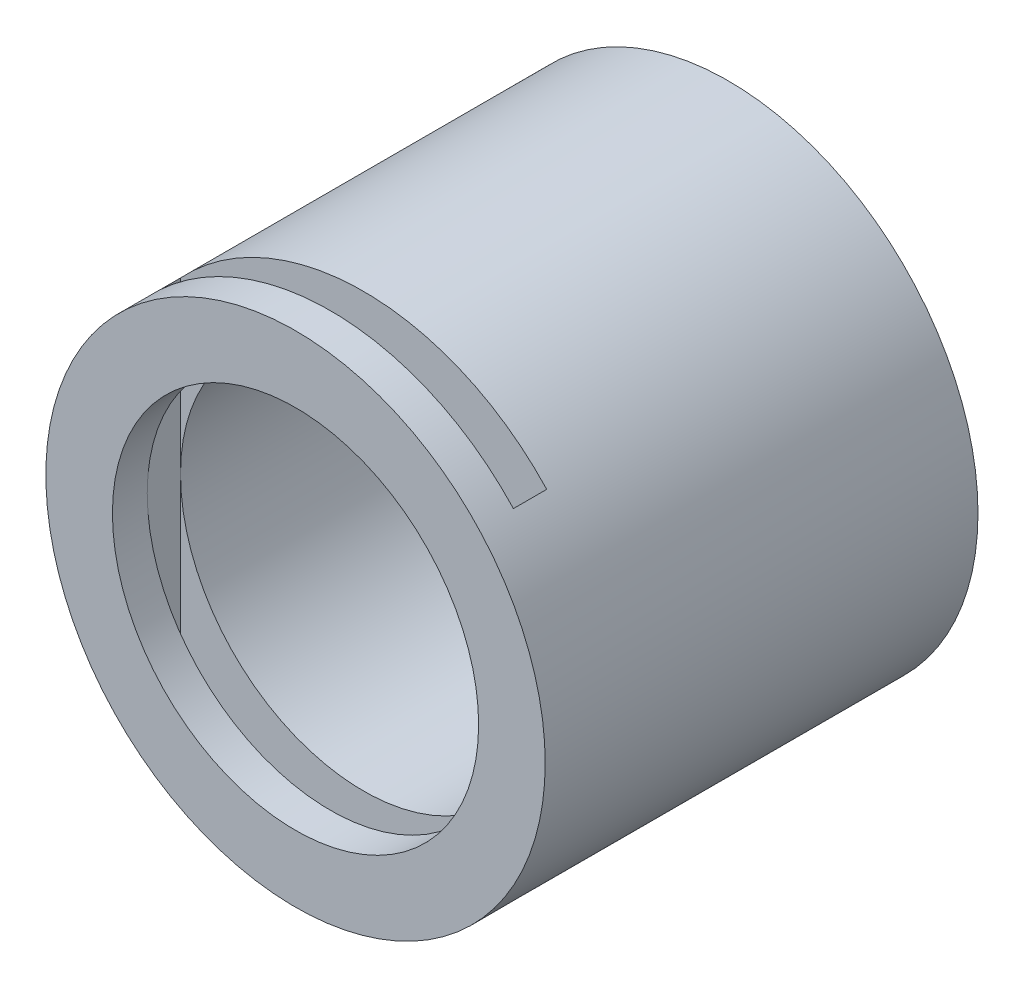
ISO-10303-21;
HEADER;
FILE_DESCRIPTION(('STEP AP214'),'2;1');
FILE_NAME('part.step','',(''),(''),'','','');
FILE_SCHEMA(('AUTOMOTIVE_DESIGN { 1 0 10303 214 1 1 1 1 }'));
ENDSEC;
DATA;
#1=APPLICATION_CONTEXT('core data for automotive mechanical design processes');
#2=APPLICATION_PROTOCOL_DEFINITION('international standard','automotive_design',2000,#1);
#3=PRODUCT_CONTEXT('',#1,'mechanical');
#4=PRODUCT('Part','Part','',(#3));
#5=PRODUCT_RELATED_PRODUCT_CATEGORY('part','',(#4));
#6=PRODUCT_DEFINITION_FORMATION('','',#4);
#7=PRODUCT_DEFINITION_CONTEXT('part definition',#1,'design');
#8=PRODUCT_DEFINITION('design','',#6,#7);
#9=PRODUCT_DEFINITION_SHAPE('','',#8);
#10=(LENGTH_UNIT() NAMED_UNIT(*) SI_UNIT(.MILLI.,.METRE.));
#11=(NAMED_UNIT(*) PLANE_ANGLE_UNIT() SI_UNIT($,.RADIAN.));
#12=(NAMED_UNIT(*) SI_UNIT($,.STERADIAN.) SOLID_ANGLE_UNIT());
#13=UNCERTAINTY_MEASURE_WITH_UNIT(LENGTH_MEASURE(1.E-05),#10,'distance_accuracy_value','');
#14=(GEOMETRIC_REPRESENTATION_CONTEXT(3) GLOBAL_UNCERTAINTY_ASSIGNED_CONTEXT((#13)) GLOBAL_UNIT_ASSIGNED_CONTEXT((#10,
#11,#12)) REPRESENTATION_CONTEXT('',''));
#15=CARTESIAN_POINT('',(0.,0.,0.));
#16=DIRECTION('',(0.,0.,1.));
#17=DIRECTION('',(1.,0.,0.));
#18=AXIS2_PLACEMENT_3D('',#15,#16,#17);
#19=CARTESIAN_POINT('',(0.,0.,5.99999999999999));
#20=DIRECTION('',(0.,0.,1.));
#21=DIRECTION('',(1.,0.,0.));
#22=AXIS2_PLACEMENT_3D('',#19,#20,#21);
#23=PLANE('',#22);
#24=CARTESIAN_POINT('',(0.,0.,5.99999999999999));
#25=DIRECTION('',(0.,0.,1.));
#26=DIRECTION('',(1.,0.,0.));
#27=AXIS2_PLACEMENT_3D('',#24,#25,#26);
#28=CIRCLE('',#27,5.625);
#29=CARTESIAN_POINT('',(5.625,0.,5.99999999999999));
#30=VERTEX_POINT('',#29);
#31=EDGE_CURVE('E121',#30,#30,#28,.F.);
#32=ORIENTED_EDGE('',*,*,#31,.T.);
#33=EDGE_LOOP('',(#32));
#34=FACE_BOUND('',#33,.T.);
#35=CARTESIAN_POINT('',(0.,0.,5.99999999999999));
#36=DIRECTION('',(0.,0.,1.));
#37=DIRECTION('',(1.,0.,0.));
#38=AXIS2_PLACEMENT_3D('',#35,#36,#37);
#39=CIRCLE('',#38,9.);
#40=CARTESIAN_POINT('',(9.,0.,5.99999999999999));
#41=VERTEX_POINT('',#40);
#42=EDGE_CURVE('E165',#41,#41,#39,.T.);
#43=ORIENTED_EDGE('',*,*,#42,.T.);
#44=EDGE_LOOP('',(#43));
#45=FACE_BOUND('',#44,.T.);
#46=ADVANCED_FACE('F33',(#34,#45),#23,.T.);
#47=CARTESIAN_POINT('',(0.,0.,5.99999999999999));
#48=DIRECTION('',(0.,0.,1.));
#49=DIRECTION('',(1.,0.,0.));
#50=AXIS2_PLACEMENT_3D('',#47,#48,#49);
#51=CYLINDRICAL_SURFACE('',#50,11.);
#52=CARTESIAN_POINT('',(0.,0.,21.9095855695591));
#53=DIRECTION('',(0.,0.,-1.));
#54=DIRECTION('',(-1.,0.,0.));
#55=AXIS2_PLACEMENT_3D('',#52,#53,#54);
#56=CIRCLE('',#55,11.);
#57=CARTESIAN_POINT('',(11.,0.,21.9095855695591));
#58=VERTEX_POINT('',#57);
#59=CARTESIAN_POINT('',(-11.,0.,21.9095855695591));
#60=VERTEX_POINT('',#59);
#61=EDGE_CURVE('E37',#58,#60,#56,.F.);
#62=ORIENTED_EDGE('',*,*,#61,.T.);
#63=EDGE_CURVE('E11',#60,#58,#56,.F.);
#64=ORIENTED_EDGE('',*,*,#63,.T.);
#65=EDGE_LOOP('',(#62,#64));
#66=FACE_BOUND('',#65,.T.);
#67=CARTESIAN_POINT('',(0.,0.,3.99999999999999));
#68=DIRECTION('',(0.,0.,1.));
#69=DIRECTION('',(1.,0.,0.));
#70=AXIS2_PLACEMENT_3D('',#67,#68,#69);
#71=CIRCLE('',#70,11.);
#72=CARTESIAN_POINT('',(11.,0.,3.99999999999999));
#73=VERTEX_POINT('',#72);
#74=EDGE_CURVE('E158',#73,#73,#71,.T.);
#75=ORIENTED_EDGE('',*,*,#74,.F.);
#76=EDGE_LOOP('',(#75));
#77=FACE_BOUND('',#76,.T.);
#78=ADVANCED_FACE('F139',(#66,#77),#51,.F.);
#79=CARTESIAN_POINT('',(0.,0.,0.));
#80=DIRECTION('',(0.,0.,1.));
#81=DIRECTION('',(1.,0.,0.));
#82=AXIS2_PLACEMENT_3D('',#79,#80,#81);
#83=CYLINDRICAL_SURFACE('',#82,5.625);
#84=CARTESIAN_POINT('',(0.,0.,0.));
#85=DIRECTION('',(0.,0.,1.));
#86=DIRECTION('',(1.,0.,0.));
#87=AXIS2_PLACEMENT_3D('',#84,#85,#86);
#88=CIRCLE('',#87,5.625);
#89=CARTESIAN_POINT('',(5.625,0.,0.));
#90=VERTEX_POINT('',#89);
#91=EDGE_CURVE('E122',#90,#90,#88,.T.);
#92=ORIENTED_EDGE('',*,*,#91,.F.);
#93=EDGE_LOOP('',(#92));
#94=FACE_BOUND('',#93,.T.);
#95=ORIENTED_EDGE('',*,*,#31,.F.);
#96=EDGE_LOOP('',(#95));
#97=FACE_BOUND('',#96,.T.);
#98=ADVANCED_FACE('F189',(#94,#97),#83,.F.);
#99=CARTESIAN_POINT('',(0.,0.,26.));
#100=DIRECTION('',(0.,0.,-1.));
#101=DIRECTION('',(-1.,0.,0.));
#102=AXIS2_PLACEMENT_3D('',#99,#100,#101);
#103=CYLINDRICAL_SURFACE('',#102,15.);
#104=DIRECTION('',(0.,0.,-1.));
#105=VECTOR('',#104,1.);
#106=CARTESIAN_POINT('',(-11.,-10.1980390271856,26.));
#107=LINE('',#106,#105);
#108=CARTESIAN_POINT('',(-11.,-10.1980390271856,21.9095855695591));
#109=VERTEX_POINT('',#108);
#110=CARTESIAN_POINT('',(-11.,-10.1980390271856,23.9095855695591));
#111=VERTEX_POINT('',#110);
#112=EDGE_CURVE('E114',#109,#111,#107,.F.);
#113=ORIENTED_EDGE('',*,*,#112,.T.);
#114=CARTESIAN_POINT('',(0.,0.,23.9095855695591));
#115=DIRECTION('',(0.,0.,1.));
#116=DIRECTION('',(1.,0.,0.));
#117=AXIS2_PLACEMENT_3D('',#114,#115,#116);
#118=CIRCLE('',#117,15.);
#119=CARTESIAN_POINT('',(11.,-10.1980390271856,23.9095855695591));
#120=VERTEX_POINT('',#119);
#121=EDGE_CURVE('E48',#111,#120,#118,.T.);
#122=ORIENTED_EDGE('',*,*,#121,.T.);
#123=DIRECTION('',(0.,0.,-1.));
#124=VECTOR('',#123,1.);
#125=CARTESIAN_POINT('',(11.,-10.1980390271856,26.));
#126=LINE('',#125,#124);
#127=CARTESIAN_POINT('',(11.,-10.1980390271856,21.9095855695591));
#128=VERTEX_POINT('',#127);
#129=EDGE_CURVE('E107',#120,#128,#126,.T.);
#130=ORIENTED_EDGE('',*,*,#129,.T.);
#131=CARTESIAN_POINT('',(0.,0.,21.9095855695591));
#132=DIRECTION('',(0.,0.,-1.));
#133=DIRECTION('',(-1.,0.,0.));
#134=AXIS2_PLACEMENT_3D('',#131,#132,#133);
#135=CIRCLE('',#134,15.);
#136=EDGE_CURVE('E109',#128,#109,#135,.T.);
#137=ORIENTED_EDGE('',*,*,#136,.T.);
#138=EDGE_LOOP('',(#113,#122,#130,#137));
#139=FACE_BOUND('',#138,.T.);
#140=DIRECTION('',(0.,0.,-1.));
#141=VECTOR('',#140,1.);
#142=CARTESIAN_POINT('',(11.,10.1980390271856,26.));
#143=LINE('',#142,#141);
#144=CARTESIAN_POINT('',(11.,10.1980390271856,21.9095855695591));
#145=VERTEX_POINT('',#144);
#146=CARTESIAN_POINT('',(11.,10.1980390271856,23.9095855695591));
#147=VERTEX_POINT('',#146);
#148=EDGE_CURVE('E94',#145,#147,#143,.F.);
#149=ORIENTED_EDGE('',*,*,#148,.T.);
#150=CARTESIAN_POINT('',(-11.,10.1980390271856,23.9095855695591));
#151=VERTEX_POINT('',#150);
#152=EDGE_CURVE('E56',#147,#151,#118,.T.);
#153=ORIENTED_EDGE('',*,*,#152,.T.);
#154=DIRECTION('',(0.,0.,-1.));
#155=VECTOR('',#154,1.);
#156=CARTESIAN_POINT('',(-11.,10.1980390271856,26.));
#157=LINE('',#156,#155);
#158=CARTESIAN_POINT('',(-11.,10.1980390271856,21.9095855695591));
#159=VERTEX_POINT('',#158);
#160=EDGE_CURVE('E116',#151,#159,#157,.T.);
#161=ORIENTED_EDGE('',*,*,#160,.T.);
#162=EDGE_CURVE('E106',#159,#145,#135,.T.);
#163=ORIENTED_EDGE('',*,*,#162,.T.);
#164=EDGE_LOOP('',(#149,#153,#161,#163));
#165=FACE_BOUND('',#164,.T.);
#166=CARTESIAN_POINT('',(0.,0.,26.));
#167=DIRECTION('',(0.,0.,1.));
#168=DIRECTION('',(1.,0.,0.));
#169=AXIS2_PLACEMENT_3D('',#166,#167,#168);
#170=CIRCLE('',#169,15.);
#171=CARTESIAN_POINT('',(15.,0.,26.));
#172=VERTEX_POINT('',#171);
#173=EDGE_CURVE('E126',#172,#172,#170,.T.);
#174=ORIENTED_EDGE('',*,*,#173,.F.);
#175=EDGE_LOOP('',(#174));
#176=FACE_BOUND('',#175,.T.);
#177=CARTESIAN_POINT('',(0.,0.,0.));
#178=DIRECTION('',(0.,0.,1.));
#179=DIRECTION('',(1.,0.,0.));
#180=AXIS2_PLACEMENT_3D('',#177,#178,#179);
#181=CIRCLE('',#180,15.);
#182=CARTESIAN_POINT('',(15.,0.,0.));
#183=VERTEX_POINT('',#182);
#184=EDGE_CURVE('E125',#183,#183,#181,.T.);
#185=ORIENTED_EDGE('',*,*,#184,.T.);
#186=EDGE_LOOP('',(#185));
#187=FACE_BOUND('',#186,.T.);
#188=ADVANCED_FACE('F35',(#139,#165,#176,#187),#103,.T.);
#189=CARTESIAN_POINT('',(0.,0.,26.));
#190=DIRECTION('',(0.,0.,1.));
#191=DIRECTION('',(1.,0.,0.));
#192=AXIS2_PLACEMENT_3D('',#189,#190,#191);
#193=PLANE('',#192);
#194=CARTESIAN_POINT('',(0.,0.,26.));
#195=DIRECTION('',(0.,0.,1.));
#196=DIRECTION('',(1.,0.,0.));
#197=AXIS2_PLACEMENT_3D('',#194,#195,#196);
#198=CIRCLE('',#197,11.);
#199=CARTESIAN_POINT('',(11.,0.,26.));
#200=VERTEX_POINT('',#199);
#201=EDGE_CURVE('E118',#200,#200,#198,.T.);
#202=ORIENTED_EDGE('',*,*,#201,.F.);
#203=EDGE_LOOP('',(#202));
#204=FACE_BOUND('',#203,.T.);
#205=ORIENTED_EDGE('',*,*,#173,.T.);
#206=EDGE_LOOP('',(#205));
#207=FACE_BOUND('',#206,.T.);
#208=ADVANCED_FACE('F201',(#204,#207),#193,.T.);
#209=CARTESIAN_POINT('',(0.,0.,0.));
#210=DIRECTION('',(0.,0.,1.));
#211=DIRECTION('',(1.,0.,0.));
#212=AXIS2_PLACEMENT_3D('',#209,#210,#211);
#213=PLANE('',#212);
#214=ORIENTED_EDGE('',*,*,#91,.T.);
#215=EDGE_LOOP('',(#214));
#216=FACE_BOUND('',#215,.T.);
#217=ORIENTED_EDGE('',*,*,#184,.F.);
#218=EDGE_LOOP('',(#217));
#219=FACE_BOUND('',#218,.T.);
#220=ADVANCED_FACE('F197',(#216,#219),#213,.F.);
#221=CARTESIAN_POINT('',(0.,0.,23.9095855695591));
#222=DIRECTION('',(0.,0.,1.));
#223=DIRECTION('',(1.,0.,0.));
#224=AXIS2_PLACEMENT_3D('',#221,#222,#223);
#225=CIRCLE('',#224,11.);
#226=CARTESIAN_POINT('',(-11.,0.,23.9095855695591));
#227=VERTEX_POINT('',#226);
#228=CARTESIAN_POINT('',(11.,0.,23.9095855695591));
#229=VERTEX_POINT('',#228);
#230=EDGE_CURVE('E129',#227,#229,#225,.F.);
#231=ORIENTED_EDGE('',*,*,#230,.T.);
#232=EDGE_CURVE('E134',#229,#227,#225,.F.);
#233=ORIENTED_EDGE('',*,*,#232,.T.);
#234=EDGE_LOOP('',(#231,#233));
#235=FACE_BOUND('',#234,.T.);
#236=ORIENTED_EDGE('',*,*,#201,.T.);
#237=EDGE_LOOP('',(#236));
#238=FACE_BOUND('',#237,.T.);
#239=ADVANCED_FACE('F191',(#235,#238),#51,.F.);
#240=CARTESIAN_POINT('',(-11.,-15.,21.9095855695591));
#241=DIRECTION('',(-1.,0.,0.));
#242=DIRECTION('',(0.,0.,1.));
#243=AXIS2_PLACEMENT_3D('',#240,#241,#242);
#244=PLANE('',#243);
#245=DIRECTION('',(0.,1.,0.));
#246=VECTOR('',#245,1.);
#247=CARTESIAN_POINT('',(-11.,-15.,23.9095855695591));
#248=LINE('',#247,#246);
#249=EDGE_CURVE('E92',#227,#151,#248,.T.);
#250=ORIENTED_EDGE('',*,*,#249,.F.);
#251=EDGE_CURVE('E103',#111,#227,#248,.T.);
#252=ORIENTED_EDGE('',*,*,#251,.F.);
#253=ORIENTED_EDGE('',*,*,#112,.F.);
#254=DIRECTION('',(0.,1.,0.));
#255=VECTOR('',#254,1.);
#256=CARTESIAN_POINT('',(-11.,-15.,21.9095855695591));
#257=LINE('',#256,#255);
#258=EDGE_CURVE('E155',#109,#60,#257,.T.);
#259=ORIENTED_EDGE('',*,*,#258,.T.);
#260=EDGE_CURVE('E147',#60,#159,#257,.T.);
#261=ORIENTED_EDGE('',*,*,#260,.T.);
#262=ORIENTED_EDGE('',*,*,#160,.F.);
#263=EDGE_LOOP('',(#250,#252,#253,#259,#261,#262));
#264=FACE_BOUND('',#263,.T.);
#265=ADVANCED_FACE('F193',(#264),#244,.F.);
#266=CARTESIAN_POINT('',(-11.,-15.,21.9095855695591));
#267=DIRECTION('',(0.,0.,-1.));
#268=DIRECTION('',(-1.,0.,0.));
#269=AXIS2_PLACEMENT_3D('',#266,#267,#268);
#270=PLANE('',#269);
#271=ORIENTED_EDGE('',*,*,#260,.F.);
#272=ORIENTED_EDGE('',*,*,#61,.F.);
#273=DIRECTION('',(0.,1.,0.));
#274=VECTOR('',#273,1.);
#275=CARTESIAN_POINT('',(11.,-15.,21.9095855695591));
#276=LINE('',#275,#274);
#277=EDGE_CURVE('E145',#58,#145,#276,.T.);
#278=ORIENTED_EDGE('',*,*,#277,.T.);
#279=ORIENTED_EDGE('',*,*,#162,.F.);
#280=EDGE_LOOP('',(#271,#272,#278,#279));
#281=FACE_BOUND('',#280,.T.);
#282=ADVANCED_FACE('F144',(#281),#270,.F.);
#283=EDGE_CURVE('E150',#128,#58,#276,.T.);
#284=ORIENTED_EDGE('',*,*,#283,.T.);
#285=ORIENTED_EDGE('',*,*,#63,.F.);
#286=ORIENTED_EDGE('',*,*,#258,.F.);
#287=ORIENTED_EDGE('',*,*,#136,.F.);
#288=EDGE_LOOP('',(#284,#285,#286,#287));
#289=FACE_BOUND('',#288,.T.);
#290=ADVANCED_FACE('F153',(#289),#270,.F.);
#291=CARTESIAN_POINT('',(11.,-15.,21.9095855695591));
#292=DIRECTION('',(1.,0.,0.));
#293=DIRECTION('',(0.,0.,-1.));
#294=AXIS2_PLACEMENT_3D('',#291,#292,#293);
#295=PLANE('',#294);
#296=DIRECTION('',(0.,1.,0.));
#297=VECTOR('',#296,1.);
#298=CARTESIAN_POINT('',(11.,-15.,23.9095855695591));
#299=LINE('',#298,#297);
#300=EDGE_CURVE('E102',#120,#229,#299,.T.);
#301=ORIENTED_EDGE('',*,*,#300,.T.);
#302=EDGE_CURVE('E89',#229,#147,#299,.T.);
#303=ORIENTED_EDGE('',*,*,#302,.T.);
#304=ORIENTED_EDGE('',*,*,#148,.F.);
#305=ORIENTED_EDGE('',*,*,#277,.F.);
#306=ORIENTED_EDGE('',*,*,#283,.F.);
#307=ORIENTED_EDGE('',*,*,#129,.F.);
#308=EDGE_LOOP('',(#301,#303,#304,#305,#306,#307));
#309=FACE_BOUND('',#308,.T.);
#310=ADVANCED_FACE('F98',(#309),#295,.F.);
#311=CARTESIAN_POINT('',(-11.,-15.,23.9095855695591));
#312=DIRECTION('',(0.,0.,1.));
#313=DIRECTION('',(1.,0.,0.));
#314=AXIS2_PLACEMENT_3D('',#311,#312,#313);
#315=PLANE('',#314);
#316=ORIENTED_EDGE('',*,*,#302,.F.);
#317=ORIENTED_EDGE('',*,*,#230,.F.);
#318=ORIENTED_EDGE('',*,*,#249,.T.);
#319=ORIENTED_EDGE('',*,*,#152,.F.);
#320=EDGE_LOOP('',(#316,#317,#318,#319));
#321=FACE_BOUND('',#320,.T.);
#322=ADVANCED_FACE('F88',(#321),#315,.F.);
#323=ORIENTED_EDGE('',*,*,#251,.T.);
#324=ORIENTED_EDGE('',*,*,#232,.F.);
#325=ORIENTED_EDGE('',*,*,#300,.F.);
#326=ORIENTED_EDGE('',*,*,#121,.F.);
#327=EDGE_LOOP('',(#323,#324,#325,#326));
#328=FACE_BOUND('',#327,.T.);
#329=ADVANCED_FACE('F180',(#328),#315,.F.);
#330=CARTESIAN_POINT('',(0.,0.,3.99999999999999));
#331=DIRECTION('',(0.,0.,1.));
#332=DIRECTION('',(1.,0.,0.));
#333=AXIS2_PLACEMENT_3D('',#330,#331,#332);
#334=PLANE('',#333);
#335=CARTESIAN_POINT('',(0.,0.,3.99999999999999));
#336=DIRECTION('',(0.,0.,1.));
#337=DIRECTION('',(1.,0.,0.));
#338=AXIS2_PLACEMENT_3D('',#335,#336,#337);
#339=CIRCLE('',#338,9.);
#340=CARTESIAN_POINT('',(9.,0.,3.99999999999999));
#341=VERTEX_POINT('',#340);
#342=EDGE_CURVE('E161',#341,#341,#339,.T.);
#343=ORIENTED_EDGE('',*,*,#342,.F.);
#344=EDGE_LOOP('',(#343));
#345=FACE_BOUND('',#344,.T.);
#346=ORIENTED_EDGE('',*,*,#74,.T.);
#347=EDGE_LOOP('',(#346));
#348=FACE_BOUND('',#347,.T.);
#349=ADVANCED_FACE('F174',(#345,#348),#334,.T.);
#350=CARTESIAN_POINT('',(0.,0.,3.99999999999999));
#351=DIRECTION('',(0.,0.,1.));
#352=DIRECTION('',(1.,0.,0.));
#353=AXIS2_PLACEMENT_3D('',#350,#351,#352);
#354=CYLINDRICAL_SURFACE('',#353,9.);
#355=ORIENTED_EDGE('',*,*,#342,.T.);
#356=EDGE_LOOP('',(#355));
#357=FACE_BOUND('',#356,.T.);
#358=ORIENTED_EDGE('',*,*,#42,.F.);
#359=EDGE_LOOP('',(#358));
#360=FACE_BOUND('',#359,.T.);
#361=ADVANCED_FACE('F172',(#357,#360),#354,.T.);
#362=CLOSED_SHELL('',(#46,#78,#98,#188,#208,#220,#239,#265,#282,#290,#310,#322,#329,#349,#361));
#363=MANIFOLD_SOLID_BREP('B2',#362);
#364=ADVANCED_BREP_SHAPE_REPRESENTATION('',(#18,#363),#14);
#365=SHAPE_DEFINITION_REPRESENTATION(#9,#364);
ENDSEC;
END-ISO-10303-21;
